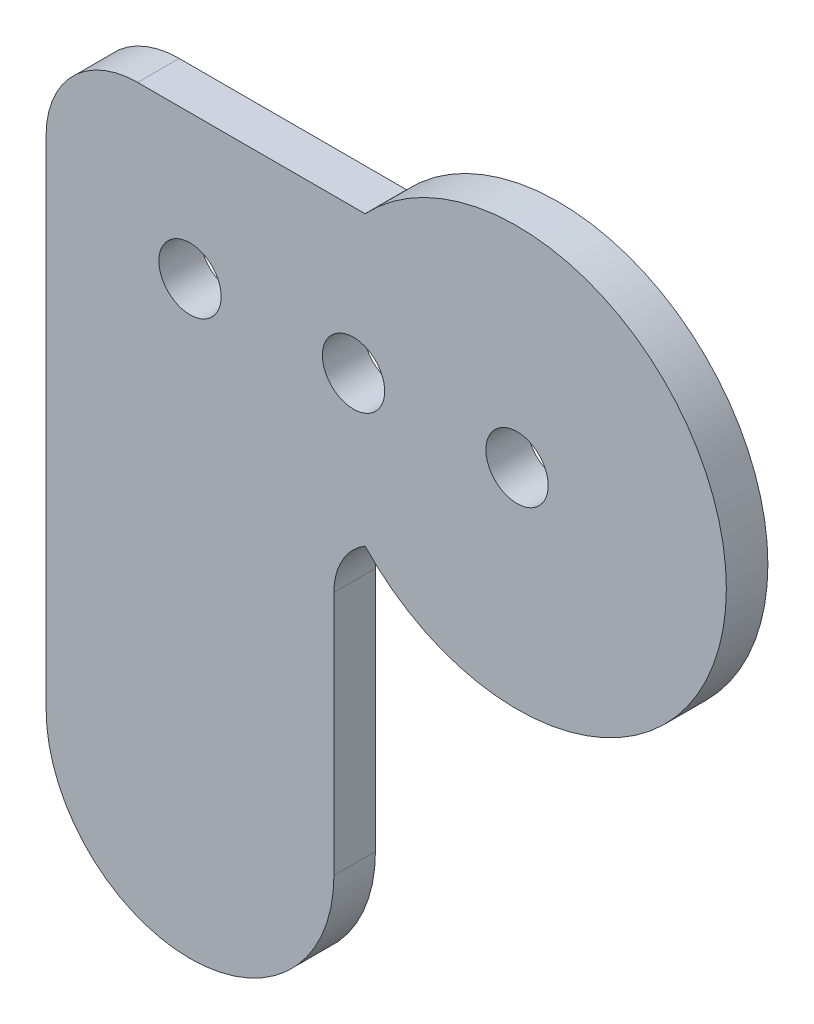
ISO-10303-21;
HEADER;
FILE_DESCRIPTION(('STEP AP214'),'2;1');
FILE_NAME('part.step','',(''),(''),'','','');
FILE_SCHEMA(('AUTOMOTIVE_DESIGN { 1 0 10303 214 1 1 1 1 }'));
ENDSEC;
DATA;
#1=APPLICATION_CONTEXT('core data for automotive mechanical design processes');
#2=APPLICATION_PROTOCOL_DEFINITION('international standard','automotive_design',2000,#1);
#3=PRODUCT_CONTEXT('',#1,'mechanical');
#4=PRODUCT('Part','Part','',(#3));
#5=PRODUCT_RELATED_PRODUCT_CATEGORY('part','',(#4));
#6=PRODUCT_DEFINITION_FORMATION('','',#4);
#7=PRODUCT_DEFINITION_CONTEXT('part definition',#1,'design');
#8=PRODUCT_DEFINITION('design','',#6,#7);
#9=PRODUCT_DEFINITION_SHAPE('','',#8);
#10=(LENGTH_UNIT() NAMED_UNIT(*) SI_UNIT(.MILLI.,.METRE.));
#11=(NAMED_UNIT(*) PLANE_ANGLE_UNIT() SI_UNIT($,.RADIAN.));
#12=(NAMED_UNIT(*) SI_UNIT($,.STERADIAN.) SOLID_ANGLE_UNIT());
#13=UNCERTAINTY_MEASURE_WITH_UNIT(LENGTH_MEASURE(1.E-05),#10,'distance_accuracy_value','');
#14=(GEOMETRIC_REPRESENTATION_CONTEXT(3) GLOBAL_UNCERTAINTY_ASSIGNED_CONTEXT((#13)) GLOBAL_UNIT_ASSIGNED_CONTEXT((#10,
#11,#12)) REPRESENTATION_CONTEXT('',''));
#15=CARTESIAN_POINT('',(0.,0.,0.));
#16=DIRECTION('',(0.,0.,1.));
#17=DIRECTION('',(1.,0.,0.));
#18=AXIS2_PLACEMENT_3D('',#15,#16,#17);
#19=CARTESIAN_POINT('',(0.,0.,3.175));
#20=DIRECTION('',(0.,0.,-1.));
#21=DIRECTION('',(-1.,0.,0.));
#22=AXIS2_PLACEMENT_3D('',#19,#20,#21);
#23=CYLINDRICAL_SURFACE('',#22,16.);
#24=CARTESIAN_POINT('',(0.,0.,0.));
#25=DIRECTION('',(0.,0.,1.));
#26=DIRECTION('',(1.,0.,0.));
#27=AXIS2_PLACEMENT_3D('',#24,#25,#26);
#28=CIRCLE('',#27,16.);
#29=CARTESIAN_POINT('',(-11.6189500386223,-11.,0.));
#30=VERTEX_POINT('',#29);
#31=CARTESIAN_POINT('',(-11.6189500386223,11.,0.));
#32=VERTEX_POINT('',#31);
#33=EDGE_CURVE('E115',#30,#32,#28,.T.);
#34=ORIENTED_EDGE('',*,*,#33,.T.);
#35=DIRECTION('',(0.,0.,-1.));
#36=VECTOR('',#35,1.);
#37=CARTESIAN_POINT('',(-11.6189500386223,11.,3.175));
#38=LINE('',#37,#36);
#39=CARTESIAN_POINT('',(-11.6189500386223,11.,3.175));
#40=VERTEX_POINT('',#39);
#41=EDGE_CURVE('E98',#40,#32,#38,.T.);
#42=ORIENTED_EDGE('',*,*,#41,.F.);
#43=CARTESIAN_POINT('',(0.,0.,3.175));
#44=DIRECTION('',(0.,0.,1.));
#45=DIRECTION('',(1.,0.,0.));
#46=AXIS2_PLACEMENT_3D('',#43,#44,#45);
#47=CIRCLE('',#46,16.);
#48=CARTESIAN_POINT('',(-11.6189500386223,-11.,3.175));
#49=VERTEX_POINT('',#48);
#50=EDGE_CURVE('E105',#49,#40,#47,.T.);
#51=ORIENTED_EDGE('',*,*,#50,.F.);
#52=DIRECTION('',(0.,0.,-1.));
#53=VECTOR('',#52,1.);
#54=CARTESIAN_POINT('',(-11.6189500386223,-11.,3.175));
#55=LINE('',#54,#53);
#56=EDGE_CURVE('E155',#49,#30,#55,.T.);
#57=ORIENTED_EDGE('',*,*,#56,.T.);
#58=EDGE_LOOP('',(#34,#42,#51,#57));
#59=FACE_BOUND('',#58,.T.);
#60=ADVANCED_FACE('F34',(#59),#23,.T.);
#61=CARTESIAN_POINT('',(-11.6189500386223,11.,3.175));
#62=DIRECTION('',(0.,-1.,0.));
#63=DIRECTION('',(1.,0.,0.));
#64=AXIS2_PLACEMENT_3D('',#61,#62,#63);
#65=PLANE('',#64);
#66=DIRECTION('',(-1.,0.,0.));
#67=VECTOR('',#66,1.);
#68=CARTESIAN_POINT('',(-11.6189500386223,11.,0.));
#69=LINE('',#68,#67);
#70=CARTESIAN_POINT('',(-29.,11.,0.));
#71=VERTEX_POINT('',#70);
#72=EDGE_CURVE('E143',#32,#71,#69,.T.);
#73=ORIENTED_EDGE('',*,*,#72,.T.);
#74=DIRECTION('',(0.,0.,-1.));
#75=VECTOR('',#74,1.);
#76=CARTESIAN_POINT('',(-29.,11.,3.175));
#77=LINE('',#76,#75);
#78=CARTESIAN_POINT('',(-29.,11.,3.175));
#79=VERTEX_POINT('',#78);
#80=EDGE_CURVE('E101',#71,#79,#77,.F.);
#81=ORIENTED_EDGE('',*,*,#80,.T.);
#82=DIRECTION('',(-1.,0.,0.));
#83=VECTOR('',#82,1.);
#84=CARTESIAN_POINT('',(-11.6189500386223,11.,3.175));
#85=LINE('',#84,#83);
#86=EDGE_CURVE('E93',#40,#79,#85,.T.);
#87=ORIENTED_EDGE('',*,*,#86,.F.);
#88=ORIENTED_EDGE('',*,*,#41,.T.);
#89=EDGE_LOOP('',(#73,#81,#87,#88));
#90=FACE_BOUND('',#89,.T.);
#91=ADVANCED_FACE('F96',(#90),#65,.F.);
#92=CARTESIAN_POINT('',(-36.,11.,3.175));
#93=DIRECTION('',(1.,0.,0.));
#94=DIRECTION('',(0.,1.,0.));
#95=AXIS2_PLACEMENT_3D('',#92,#93,#94);
#96=PLANE('',#95);
#97=DIRECTION('',(0.,-1.,0.));
#98=VECTOR('',#97,1.);
#99=CARTESIAN_POINT('',(-36.,11.,3.175));
#100=LINE('',#99,#98);
#101=CARTESIAN_POINT('',(-36.,3.99999999999999,3.175));
#102=VERTEX_POINT('',#101);
#103=CARTESIAN_POINT('',(-36.,-34.,3.175));
#104=VERTEX_POINT('',#103);
#105=EDGE_CURVE('E104',#102,#104,#100,.T.);
#106=ORIENTED_EDGE('',*,*,#105,.F.);
#107=DIRECTION('',(0.,0.,-1.));
#108=VECTOR('',#107,1.);
#109=CARTESIAN_POINT('',(-36.,3.99999999999999,3.175));
#110=LINE('',#109,#108);
#111=CARTESIAN_POINT('',(-36.,3.99999999999999,0.));
#112=VERTEX_POINT('',#111);
#113=EDGE_CURVE('E116',#102,#112,#110,.T.);
#114=ORIENTED_EDGE('',*,*,#113,.T.);
#115=DIRECTION('',(0.,-1.,0.));
#116=VECTOR('',#115,1.);
#117=CARTESIAN_POINT('',(-36.,11.,0.));
#118=LINE('',#117,#116);
#119=CARTESIAN_POINT('',(-36.,-34.,0.));
#120=VERTEX_POINT('',#119);
#121=EDGE_CURVE('E145',#112,#120,#118,.T.);
#122=ORIENTED_EDGE('',*,*,#121,.T.);
#123=DIRECTION('',(0.,0.,-1.));
#124=VECTOR('',#123,1.);
#125=CARTESIAN_POINT('',(-36.,-34.,3.175));
#126=LINE('',#125,#124);
#127=EDGE_CURVE('E117',#104,#120,#126,.T.);
#128=ORIENTED_EDGE('',*,*,#127,.F.);
#129=EDGE_LOOP('',(#106,#114,#122,#128));
#130=FACE_BOUND('',#129,.T.);
#131=ADVANCED_FACE('F136',(#130),#96,.F.);
#132=CARTESIAN_POINT('',(-25.,-34.,3.175));
#133=DIRECTION('',(0.,0.,-1.));
#134=DIRECTION('',(-1.,0.,0.));
#135=AXIS2_PLACEMENT_3D('',#132,#133,#134);
#136=CYLINDRICAL_SURFACE('',#135,11.);
#137=CARTESIAN_POINT('',(-25.,-34.,0.));
#138=DIRECTION('',(0.,0.,1.));
#139=DIRECTION('',(1.,0.,0.));
#140=AXIS2_PLACEMENT_3D('',#137,#138,#139);
#141=CIRCLE('',#140,11.);
#142=CARTESIAN_POINT('',(-14.,-34.,0.));
#143=VERTEX_POINT('',#142);
#144=EDGE_CURVE('E147',#120,#143,#141,.T.);
#145=ORIENTED_EDGE('',*,*,#144,.T.);
#146=DIRECTION('',(0.,0.,-1.));
#147=VECTOR('',#146,1.);
#148=CARTESIAN_POINT('',(-14.,-34.,3.175));
#149=LINE('',#148,#147);
#150=CARTESIAN_POINT('',(-14.,-34.,3.175));
#151=VERTEX_POINT('',#150);
#152=EDGE_CURVE('E123',#151,#143,#149,.T.);
#153=ORIENTED_EDGE('',*,*,#152,.F.);
#154=CARTESIAN_POINT('',(-25.,-34.,3.175));
#155=DIRECTION('',(0.,0.,1.));
#156=DIRECTION('',(1.,0.,0.));
#157=AXIS2_PLACEMENT_3D('',#154,#155,#156);
#158=CIRCLE('',#157,11.);
#159=EDGE_CURVE('E139',#104,#151,#158,.T.);
#160=ORIENTED_EDGE('',*,*,#159,.F.);
#161=ORIENTED_EDGE('',*,*,#127,.T.);
#162=EDGE_LOOP('',(#145,#153,#160,#161));
#163=FACE_BOUND('',#162,.T.);
#164=ADVANCED_FACE('F161',(#163),#136,.T.);
#165=CARTESIAN_POINT('',(-14.,-34.,3.175));
#166=DIRECTION('',(-1.,0.,0.));
#167=DIRECTION('',(0.,-1.,0.));
#168=AXIS2_PLACEMENT_3D('',#165,#166,#167);
#169=PLANE('',#168);
#170=DIRECTION('',(0.,1.,0.));
#171=VECTOR('',#170,1.);
#172=CARTESIAN_POINT('',(-14.,-34.,0.));
#173=LINE('',#172,#171);
#174=CARTESIAN_POINT('',(-14.,-15.2592371024868,0.));
#175=VERTEX_POINT('',#174);
#176=EDGE_CURVE('E113',#143,#175,#173,.T.);
#177=ORIENTED_EDGE('',*,*,#176,.T.);
#178=DIRECTION('',(0.,0.,-1.));
#179=VECTOR('',#178,1.);
#180=CARTESIAN_POINT('',(-14.,-15.2592371024868,3.175));
#181=LINE('',#180,#179);
#182=CARTESIAN_POINT('',(-14.,-15.2592371024868,3.175));
#183=VERTEX_POINT('',#182);
#184=EDGE_CURVE('E49',#175,#183,#181,.F.);
#185=ORIENTED_EDGE('',*,*,#184,.T.);
#186=DIRECTION('',(0.,1.,0.));
#187=VECTOR('',#186,1.);
#188=CARTESIAN_POINT('',(-14.,-34.,3.175));
#189=LINE('',#188,#187);
#190=EDGE_CURVE('E156',#151,#183,#189,.T.);
#191=ORIENTED_EDGE('',*,*,#190,.F.);
#192=ORIENTED_EDGE('',*,*,#152,.T.);
#193=EDGE_LOOP('',(#177,#185,#191,#192));
#194=FACE_BOUND('',#193,.T.);
#195=ADVANCED_FACE('F159',(#194),#169,.F.);
#196=CARTESIAN_POINT('',(0.,0.,3.175));
#197=DIRECTION('',(0.,0.,1.));
#198=DIRECTION('',(1.,0.,0.));
#199=AXIS2_PLACEMENT_3D('',#196,#197,#198);
#200=PLANE('',#199);
#201=CARTESIAN_POINT('',(-12.5,0.,3.175));
#202=DIRECTION('',(0.,0.,1.));
#203=DIRECTION('',(1.,0.,0.));
#204=AXIS2_PLACEMENT_3D('',#201,#202,#203);
#205=CIRCLE('',#204,2.38125);
#206=CARTESIAN_POINT('',(-10.11875,0.,3.175));
#207=VERTEX_POINT('',#206);
#208=EDGE_CURVE('E176',#207,#207,#205,.T.);
#209=ORIENTED_EDGE('',*,*,#208,.F.);
#210=EDGE_LOOP('',(#209));
#211=FACE_BOUND('',#210,.T.);
#212=CARTESIAN_POINT('',(-25.,0.,3.175));
#213=DIRECTION('',(0.,0.,1.));
#214=DIRECTION('',(1.,0.,0.));
#215=AXIS2_PLACEMENT_3D('',#212,#213,#214);
#216=CIRCLE('',#215,2.38125);
#217=CARTESIAN_POINT('',(-22.61875,0.,3.175));
#218=VERTEX_POINT('',#217);
#219=EDGE_CURVE('E170',#218,#218,#216,.T.);
#220=ORIENTED_EDGE('',*,*,#219,.F.);
#221=EDGE_LOOP('',(#220));
#222=FACE_BOUND('',#221,.T.);
#223=CARTESIAN_POINT('',(0.,0.,3.175));
#224=DIRECTION('',(0.,0.,1.));
#225=DIRECTION('',(1.,0.,0.));
#226=AXIS2_PLACEMENT_3D('',#223,#224,#225);
#227=CIRCLE('',#226,2.38125);
#228=CARTESIAN_POINT('',(2.38125,0.,3.175));
#229=VERTEX_POINT('',#228);
#230=EDGE_CURVE('E164',#229,#229,#227,.T.);
#231=ORIENTED_EDGE('',*,*,#230,.F.);
#232=EDGE_LOOP('',(#231));
#233=FACE_BOUND('',#232,.T.);
#234=ORIENTED_EDGE('',*,*,#86,.T.);
#235=CARTESIAN_POINT('',(-29.,3.99999999999999,3.175));
#236=DIRECTION('',(0.,0.,1.));
#237=DIRECTION('',(1.,0.,0.));
#238=AXIS2_PLACEMENT_3D('',#235,#236,#237);
#239=CIRCLE('',#238,7.);
#240=EDGE_CURVE('E129',#79,#102,#239,.T.);
#241=ORIENTED_EDGE('',*,*,#240,.T.);
#242=ORIENTED_EDGE('',*,*,#105,.T.);
#243=ORIENTED_EDGE('',*,*,#159,.T.);
#244=ORIENTED_EDGE('',*,*,#190,.T.);
#245=CARTESIAN_POINT('',(-9.00000000000001,-15.2592371024868,3.175));
#246=DIRECTION('',(0.,0.,1.));
#247=DIRECTION('',(1.,0.,0.));
#248=AXIS2_PLACEMENT_3D('',#245,#246,#247);
#249=CIRCLE('',#248,5.);
#250=EDGE_CURVE('E11',#183,#49,#249,.F.);
#251=ORIENTED_EDGE('',*,*,#250,.T.);
#252=ORIENTED_EDGE('',*,*,#50,.T.);
#253=EDGE_LOOP('',(#234,#241,#242,#243,#244,#251,#252));
#254=FACE_BOUND('',#253,.T.);
#255=ADVANCED_FACE('F108',(#211,#222,#233,#254),#200,.T.);
#256=CARTESIAN_POINT('',(0.,0.,0.));
#257=DIRECTION('',(0.,0.,1.));
#258=DIRECTION('',(1.,0.,0.));
#259=AXIS2_PLACEMENT_3D('',#256,#257,#258);
#260=PLANE('',#259);
#261=CARTESIAN_POINT('',(-12.5,0.,0.));
#262=DIRECTION('',(0.,0.,1.));
#263=DIRECTION('',(1.,0.,0.));
#264=AXIS2_PLACEMENT_3D('',#261,#262,#263);
#265=CIRCLE('',#264,2.38125);
#266=CARTESIAN_POINT('',(-10.11875,0.,0.));
#267=VERTEX_POINT('',#266);
#268=EDGE_CURVE('E167',#267,#267,#265,.T.);
#269=ORIENTED_EDGE('',*,*,#268,.T.);
#270=EDGE_LOOP('',(#269));
#271=FACE_BOUND('',#270,.T.);
#272=CARTESIAN_POINT('',(-25.,0.,0.));
#273=DIRECTION('',(0.,0.,1.));
#274=DIRECTION('',(1.,0.,0.));
#275=AXIS2_PLACEMENT_3D('',#272,#273,#274);
#276=CIRCLE('',#275,2.38125);
#277=CARTESIAN_POINT('',(-22.61875,0.,0.));
#278=VERTEX_POINT('',#277);
#279=EDGE_CURVE('E173',#278,#278,#276,.T.);
#280=ORIENTED_EDGE('',*,*,#279,.T.);
#281=EDGE_LOOP('',(#280));
#282=FACE_BOUND('',#281,.T.);
#283=CARTESIAN_POINT('',(0.,0.,0.));
#284=DIRECTION('',(0.,0.,1.));
#285=DIRECTION('',(1.,0.,0.));
#286=AXIS2_PLACEMENT_3D('',#283,#284,#285);
#287=CIRCLE('',#286,2.38125);
#288=CARTESIAN_POINT('',(2.38125,0.,0.));
#289=VERTEX_POINT('',#288);
#290=EDGE_CURVE('E149',#289,#289,#287,.T.);
#291=ORIENTED_EDGE('',*,*,#290,.T.);
#292=EDGE_LOOP('',(#291));
#293=FACE_BOUND('',#292,.T.);
#294=ORIENTED_EDGE('',*,*,#121,.F.);
#295=CARTESIAN_POINT('',(-29.,3.99999999999999,0.));
#296=DIRECTION('',(0.,0.,1.));
#297=DIRECTION('',(1.,0.,0.));
#298=AXIS2_PLACEMENT_3D('',#295,#296,#297);
#299=CIRCLE('',#298,7.);
#300=EDGE_CURVE('E120',#112,#71,#299,.F.);
#301=ORIENTED_EDGE('',*,*,#300,.T.);
#302=ORIENTED_EDGE('',*,*,#72,.F.);
#303=ORIENTED_EDGE('',*,*,#33,.F.);
#304=CARTESIAN_POINT('',(-9.00000000000001,-15.2592371024868,0.));
#305=DIRECTION('',(0.,0.,1.));
#306=DIRECTION('',(1.,0.,0.));
#307=AXIS2_PLACEMENT_3D('',#304,#305,#306);
#308=CIRCLE('',#307,5.);
#309=EDGE_CURVE('E42',#30,#175,#308,.T.);
#310=ORIENTED_EDGE('',*,*,#309,.T.);
#311=ORIENTED_EDGE('',*,*,#176,.F.);
#312=ORIENTED_EDGE('',*,*,#144,.F.);
#313=EDGE_LOOP('',(#294,#301,#302,#303,#310,#311,#312));
#314=FACE_BOUND('',#313,.T.);
#315=ADVANCED_FACE('F142',(#271,#282,#293,#314),#260,.F.);
#316=CARTESIAN_POINT('',(-29.,3.99999999999999,3.175));
#317=DIRECTION('',(0.,0.,-1.));
#318=DIRECTION('',(-1.,0.,0.));
#319=AXIS2_PLACEMENT_3D('',#316,#317,#318);
#320=CYLINDRICAL_SURFACE('',#319,7.);
#321=ORIENTED_EDGE('',*,*,#240,.F.);
#322=ORIENTED_EDGE('',*,*,#80,.F.);
#323=ORIENTED_EDGE('',*,*,#300,.F.);
#324=ORIENTED_EDGE('',*,*,#113,.F.);
#325=EDGE_LOOP('',(#321,#322,#323,#324));
#326=FACE_BOUND('',#325,.T.);
#327=ADVANCED_FACE('F141',(#326),#320,.T.);
#328=CARTESIAN_POINT('',(-9.00000000000001,-15.2592371024868,3.175));
#329=DIRECTION('',(0.,0.,-1.));
#330=DIRECTION('',(-1.,0.,0.));
#331=AXIS2_PLACEMENT_3D('',#328,#329,#330);
#332=CYLINDRICAL_SURFACE('',#331,5.);
#333=ORIENTED_EDGE('',*,*,#250,.F.);
#334=ORIENTED_EDGE('',*,*,#184,.F.);
#335=ORIENTED_EDGE('',*,*,#309,.F.);
#336=ORIENTED_EDGE('',*,*,#56,.F.);
#337=EDGE_LOOP('',(#333,#334,#335,#336));
#338=FACE_BOUND('',#337,.T.);
#339=ADVANCED_FACE('F36',(#338),#332,.F.);
#340=CARTESIAN_POINT('',(0.,0.,0.));
#341=DIRECTION('',(0.,0.,1.));
#342=DIRECTION('',(1.,0.,0.));
#343=AXIS2_PLACEMENT_3D('',#340,#341,#342);
#344=CYLINDRICAL_SURFACE('',#343,2.38125);
#345=ORIENTED_EDGE('',*,*,#290,.F.);
#346=EDGE_LOOP('',(#345));
#347=FACE_BOUND('',#346,.T.);
#348=ORIENTED_EDGE('',*,*,#230,.T.);
#349=EDGE_LOOP('',(#348));
#350=FACE_BOUND('',#349,.T.);
#351=ADVANCED_FACE('F198',(#347,#350),#344,.F.);
#352=CARTESIAN_POINT('',(-25.,0.,0.));
#353=DIRECTION('',(0.,0.,1.));
#354=DIRECTION('',(1.,0.,0.));
#355=AXIS2_PLACEMENT_3D('',#352,#353,#354);
#356=CYLINDRICAL_SURFACE('',#355,2.38125);
#357=ORIENTED_EDGE('',*,*,#279,.F.);
#358=EDGE_LOOP('',(#357));
#359=FACE_BOUND('',#358,.T.);
#360=ORIENTED_EDGE('',*,*,#219,.T.);
#361=EDGE_LOOP('',(#360));
#362=FACE_BOUND('',#361,.T.);
#363=ADVANCED_FACE('F187',(#359,#362),#356,.F.);
#364=CARTESIAN_POINT('',(-12.5,0.,0.));
#365=DIRECTION('',(0.,0.,1.));
#366=DIRECTION('',(1.,0.,0.));
#367=AXIS2_PLACEMENT_3D('',#364,#365,#366);
#368=CYLINDRICAL_SURFACE('',#367,2.38125);
#369=ORIENTED_EDGE('',*,*,#268,.F.);
#370=EDGE_LOOP('',(#369));
#371=FACE_BOUND('',#370,.T.);
#372=ORIENTED_EDGE('',*,*,#208,.T.);
#373=EDGE_LOOP('',(#372));
#374=FACE_BOUND('',#373,.T.);
#375=ADVANCED_FACE('F184',(#371,#374),#368,.F.);
#376=CLOSED_SHELL('',(#60,#91,#131,#164,#195,#255,#315,#327,#339,#351,#363,#375));
#377=MANIFOLD_SOLID_BREP('B2',#376);
#378=ADVANCED_BREP_SHAPE_REPRESENTATION('',(#18,#377),#14);
#379=SHAPE_DEFINITION_REPRESENTATION(#9,#378);
ENDSEC;
END-ISO-10303-21;
